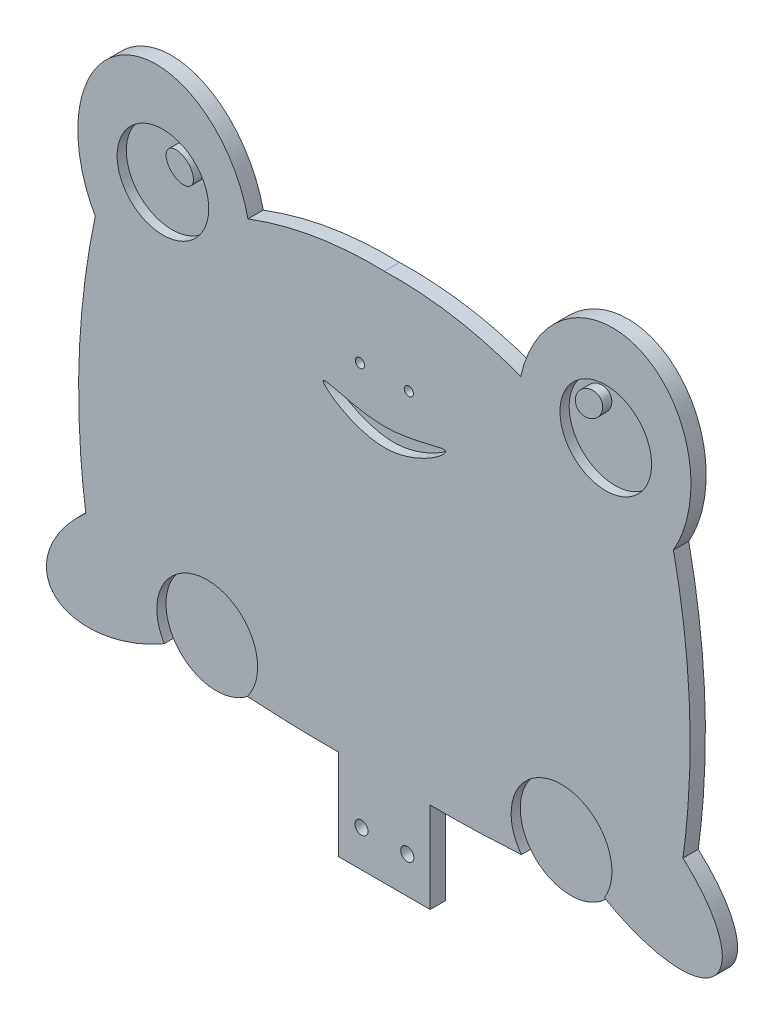
ISO-10303-21;
HEADER;
FILE_DESCRIPTION(('STEP AP214'),'2;1');
FILE_NAME('part.step','',(''),(''),'','','');
FILE_SCHEMA(('AUTOMOTIVE_DESIGN { 1 0 10303 214 1 1 1 1 }'));
ENDSEC;
DATA;
#1=APPLICATION_CONTEXT('core data for automotive mechanical design processes');
#2=APPLICATION_PROTOCOL_DEFINITION('international standard','automotive_design',2000,#1);
#3=PRODUCT_CONTEXT('',#1,'mechanical');
#4=PRODUCT('Part','Part','',(#3));
#5=PRODUCT_RELATED_PRODUCT_CATEGORY('part','',(#4));
#6=PRODUCT_DEFINITION_FORMATION('','',#4);
#7=PRODUCT_DEFINITION_CONTEXT('part definition',#1,'design');
#8=PRODUCT_DEFINITION('design','',#6,#7);
#9=PRODUCT_DEFINITION_SHAPE('','',#8);
#10=(LENGTH_UNIT() NAMED_UNIT(*) SI_UNIT(.MILLI.,.METRE.));
#11=(NAMED_UNIT(*) PLANE_ANGLE_UNIT() SI_UNIT($,.RADIAN.));
#12=(NAMED_UNIT(*) SI_UNIT($,.STERADIAN.) SOLID_ANGLE_UNIT());
#13=UNCERTAINTY_MEASURE_WITH_UNIT(LENGTH_MEASURE(1.E-05),#10,'distance_accuracy_value','');
#14=(GEOMETRIC_REPRESENTATION_CONTEXT(3) GLOBAL_UNCERTAINTY_ASSIGNED_CONTEXT((#13)) GLOBAL_UNIT_ASSIGNED_CONTEXT((#10,
#11,#12)) REPRESENTATION_CONTEXT('',''));
#15=CARTESIAN_POINT('',(0.,0.,0.));
#16=DIRECTION('',(0.,0.,1.));
#17=DIRECTION('',(1.,0.,0.));
#18=AXIS2_PLACEMENT_3D('',#15,#16,#17);
#19=CARTESIAN_POINT('',(-58.,-57.,5.));
#20=DIRECTION('',(0.,0.,-1.));
#21=DIRECTION('',(-1.,0.,0.));
#22=AXIS2_PLACEMENT_3D('',#19,#20,#21);
#23=CYLINDRICAL_SURFACE('',#22,16.5);
#24=CARTESIAN_POINT('',(-58.,-57.,2.));
#25=DIRECTION('',(0.,0.,1.));
#26=DIRECTION('',(1.,0.,0.));
#27=AXIS2_PLACEMENT_3D('',#24,#25,#26);
#28=CIRCLE('',#27,16.5);
#29=CARTESIAN_POINT('',(-72.0587340005789,-65.6372448327558,2.));
#30=VERTEX_POINT('',#29);
#31=CARTESIAN_POINT('',(-44.868666826331,-66.9909003138905,2.));
#32=VERTEX_POINT('',#31);
#33=EDGE_CURVE('E617',#30,#32,#28,.T.);
#34=ORIENTED_EDGE('',*,*,#33,.F.);
#35=DIRECTION('',(0.,0.,-1.));
#36=VECTOR('',#35,1.);
#37=CARTESIAN_POINT('',(-72.0587340005789,-65.6372448327558,5.));
#38=LINE('',#37,#36);
#39=CARTESIAN_POINT('',(-72.0587340005789,-65.6372448327558,0.));
#40=VERTEX_POINT('',#39);
#41=EDGE_CURVE('E601',#30,#40,#38,.T.);
#42=ORIENTED_EDGE('',*,*,#41,.T.);
#43=CARTESIAN_POINT('',(-58.,-57.,0.));
#44=DIRECTION('',(0.,0.,1.));
#45=DIRECTION('',(1.,0.,0.));
#46=AXIS2_PLACEMENT_3D('',#43,#44,#45);
#47=CIRCLE('',#46,16.5);
#48=CARTESIAN_POINT('',(-44.868666826331,-66.9909003138905,0.));
#49=VERTEX_POINT('',#48);
#50=EDGE_CURVE('E615',#40,#49,#47,.T.);
#51=ORIENTED_EDGE('',*,*,#50,.T.);
#52=DIRECTION('',(0.,0.,-1.));
#53=VECTOR('',#52,1.);
#54=CARTESIAN_POINT('',(-44.868666826331,-66.9909003138905,5.));
#55=LINE('',#54,#53);
#56=EDGE_CURVE('E891',#32,#49,#55,.T.);
#57=ORIENTED_EDGE('',*,*,#56,.F.);
#58=EDGE_LOOP('',(#34,#42,#51,#57));
#59=FACE_BOUND('',#58,.T.);
#60=ADVANCED_FACE('F462',(#59),#23,.T.);
#61=CARTESIAN_POINT('',(0.,0.,5.));
#62=DIRECTION('',(0.,0.,1.));
#63=DIRECTION('',(1.,0.,0.));
#64=AXIS2_PLACEMENT_3D('',#61,#62,#63);
#65=PLANE('',#64);
#66=CARTESIAN_POINT('',(-7.49999999999998,-85.5,5.));
#67=DIRECTION('',(0.,0.,1.));
#68=DIRECTION('',(1.,0.,0.));
#69=AXIS2_PLACEMENT_3D('',#66,#67,#68);
#70=CIRCLE('',#69,2.15);
#71=CARTESIAN_POINT('',(-5.34999999999998,-85.5,5.));
#72=VERTEX_POINT('',#71);
#73=EDGE_CURVE('E838',#72,#72,#70,.T.);
#74=ORIENTED_EDGE('',*,*,#73,.F.);
#75=EDGE_LOOP('',(#74));
#76=FACE_BOUND('',#75,.T.);
#77=CARTESIAN_POINT('',(7.50000000000002,-85.5,5.));
#78=DIRECTION('',(0.,0.,1.));
#79=DIRECTION('',(1.,0.,0.));
#80=AXIS2_PLACEMENT_3D('',#77,#78,#79);
#81=CIRCLE('',#80,2.15);
#82=CARTESIAN_POINT('',(9.65000000000002,-85.5,5.));
#83=VERTEX_POINT('',#82);
#84=EDGE_CURVE('E833',#83,#83,#81,.T.);
#85=ORIENTED_EDGE('',*,*,#84,.F.);
#86=EDGE_LOOP('',(#85));
#87=FACE_BOUND('',#86,.T.);
#88=CARTESIAN_POINT('',(-58.,-57.,5.));
#89=DIRECTION('',(0.,0.,1.));
#90=DIRECTION('',(1.,0.,0.));
#91=AXIS2_PLACEMENT_3D('',#88,#89,#90);
#92=CIRCLE('',#91,16.5);
#93=CARTESIAN_POINT('',(-44.868666826331,-66.9909003138905,5.));
#94=VERTEX_POINT('',#93);
#95=CARTESIAN_POINT('',(-72.0587340005789,-65.6372448327559,5.));
#96=VERTEX_POINT('',#95);
#97=EDGE_CURVE('E581',#94,#96,#92,.T.);
#98=ORIENTED_EDGE('',*,*,#97,.F.);
#99=CARTESIAN_POINT('',(-70.2828581052301,-64.5636200421426,5.));
#100=CARTESIAN_POINT('',(-35.2387588207871,-68.9830688904384,5.));
#101=CARTESIAN_POINT('',(0.,-67.5,5.));
#102=B_SPLINE_CURVE_WITH_KNOTS('',2,(#99,#100,#101),.UNSPECIFIED.,.F.,.F.,(3,3),(0.,1.),.UNSPECIFIED.);
#103=CARTESIAN_POINT('',(-15.,-67.8639775331653,5.));
#104=VERTEX_POINT('',#103);
#105=EDGE_CURVE('E975',#94,#104,#102,.T.);
#106=ORIENTED_EDGE('',*,*,#105,.T.);
#107=DIRECTION('',(0.,-1.,0.));
#108=VECTOR('',#107,1.);
#109=CARTESIAN_POINT('',(-15.,-37.5,5.));
#110=LINE('',#109,#108);
#111=CARTESIAN_POINT('',(-15.,-97.5,5.));
#112=VERTEX_POINT('',#111);
#113=EDGE_CURVE('E645',#104,#112,#110,.T.);
#114=ORIENTED_EDGE('',*,*,#113,.T.);
#115=DIRECTION('',(1.,0.,0.));
#116=VECTOR('',#115,1.);
#117=CARTESIAN_POINT('',(-15.,-97.5,5.));
#118=LINE('',#117,#116);
#119=CARTESIAN_POINT('',(15.,-97.5,5.));
#120=VERTEX_POINT('',#119);
#121=EDGE_CURVE('E639',#112,#120,#118,.T.);
#122=ORIENTED_EDGE('',*,*,#121,.T.);
#123=DIRECTION('',(0.,-1.,0.));
#124=VECTOR('',#123,1.);
#125=CARTESIAN_POINT('',(15.,-37.5,5.));
#126=LINE('',#125,#124);
#127=CARTESIAN_POINT('',(15.,-67.8639775331653,5.));
#128=VERTEX_POINT('',#127);
#129=EDGE_CURVE('E642',#128,#120,#126,.T.);
#130=ORIENTED_EDGE('',*,*,#129,.F.);
#131=CARTESIAN_POINT('',(70.2828581052301,-64.5636200421426,5.));
#132=CARTESIAN_POINT('',(35.2387588207871,-68.9830688904384,5.));
#133=CARTESIAN_POINT('',(0.,-67.5,5.));
#134=B_SPLINE_CURVE_WITH_KNOTS('',2,(#131,#132,#133),.UNSPECIFIED.,.F.,.F.,(3,3),(0.,1.),.UNSPECIFIED.);
#135=CARTESIAN_POINT('',(44.868666826331,-66.9909003138905,5.));
#136=VERTEX_POINT('',#135);
#137=EDGE_CURVE('E884',#136,#128,#134,.T.);
#138=ORIENTED_EDGE('',*,*,#137,.F.);
#139=CARTESIAN_POINT('',(58.,-57.,5.));
#140=DIRECTION('',(0.,0.,1.));
#141=DIRECTION('',(-1.,0.,0.));
#142=AXIS2_PLACEMENT_3D('',#139,#140,#141);
#143=CIRCLE('',#142,16.5);
#144=CARTESIAN_POINT('',(72.0587340005789,-65.6372448327558,5.));
#145=VERTEX_POINT('',#144);
#146=EDGE_CURVE('E807',#145,#136,#143,.T.);
#147=ORIENTED_EDGE('',*,*,#146,.F.);
#148=CARTESIAN_POINT('',(79.5578395552858,-49.7236497220535,5.));
#149=DIRECTION('',(0.,0.,-1.));
#150=DIRECTION('',(0.847998304005088,-0.52999894000318,0.));
#151=AXIS2_PLACEMENT_3D('',#148,#149,#150);
#152=ELLIPSE('',#151,35.,17.5);
#153=CARTESIAN_POINT('',(97.7708489059274,-41.5363158590221,5.));
#154=VERTEX_POINT('',#153);
#155=EDGE_CURVE('E632',#154,#145,#152,.T.);
#156=ORIENTED_EDGE('',*,*,#155,.F.);
#157=CARTESIAN_POINT('',(94.6600668169253,44.2922842673965,5.));
#158=CARTESIAN_POINT('',(105.889274695966,-8.96354800034177,5.));
#159=CARTESIAN_POINT('',(94.,-62.5,5.));
#160=B_SPLINE_CURVE_WITH_KNOTS('',2,(#157,#158,#159),.UNSPECIFIED.,.F.,.F.,(3,3),(0.,1.),.UNSPECIFIED.);
#161=CARTESIAN_POINT('',(94.6600668169253,44.2922842673965,5.));
#162=VERTEX_POINT('',#161);
#163=EDGE_CURVE('E754',#162,#154,#160,.T.);
#164=ORIENTED_EDGE('',*,*,#163,.F.);
#165=CARTESIAN_POINT('',(72.0000000000001,62.5,5.));
#166=DIRECTION('',(0.,0.,-1.));
#167=DIRECTION('',(-0.214940016820636,-0.976627251907884,0.));
#168=AXIS2_PLACEMENT_3D('',#165,#166,#167);
#169=ELLIPSE('',#168,35.1625521719047,28.);
#170=CARTESIAN_POINT('',(44.6544369465793,68.5183204709778,5.));
#171=VERTEX_POINT('',#170);
#172=EDGE_CURVE('E955',#171,#162,#169,.T.);
#173=ORIENTED_EDGE('',*,*,#172,.F.);
#174=CARTESIAN_POINT('',(44.6544369465793,68.5183204709778,5.));
#175=CARTESIAN_POINT('',(23.0941648681765,76.6590009676915,5.));
#176=CARTESIAN_POINT('',(0.,76.,5.));
#177=B_SPLINE_CURVE_WITH_KNOTS('',2,(#174,#175,#176),.UNSPECIFIED.,.F.,.F.,(3,3),(0.,1.),.UNSPECIFIED.);
#178=CARTESIAN_POINT('',(0.,76.,5.));
#179=VERTEX_POINT('',#178);
#180=EDGE_CURVE('E909',#171,#179,#177,.T.);
#181=ORIENTED_EDGE('',*,*,#180,.T.);
#182=CARTESIAN_POINT('',(-44.6544369465793,68.5183204709778,5.));
#183=CARTESIAN_POINT('',(-23.0941648681765,76.6590009676915,5.));
#184=CARTESIAN_POINT('',(0.,76.,5.));
#185=B_SPLINE_CURVE_WITH_KNOTS('',2,(#182,#183,#184),.UNSPECIFIED.,.F.,.F.,(3,3),(0.,1.),.UNSPECIFIED.);
#186=CARTESIAN_POINT('',(-44.6544369465793,68.5183204709778,5.));
#187=VERTEX_POINT('',#186);
#188=EDGE_CURVE('E958',#187,#179,#185,.T.);
#189=ORIENTED_EDGE('',*,*,#188,.F.);
#190=CARTESIAN_POINT('',(-72.0000000000001,62.5,5.));
#191=DIRECTION('',(0.,0.,1.));
#192=DIRECTION('',(0.214940016820636,-0.976627251907884,0.));
#193=AXIS2_PLACEMENT_3D('',#190,#191,#192);
#194=ELLIPSE('',#193,35.1625521719047,28.);
#195=CARTESIAN_POINT('',(-94.6600668169253,44.2922842673965,5.));
#196=VERTEX_POINT('',#195);
#197=EDGE_CURVE('E999',#187,#196,#194,.T.);
#198=ORIENTED_EDGE('',*,*,#197,.T.);
#199=CARTESIAN_POINT('',(-94.6600668169253,44.2922842673965,5.));
#200=CARTESIAN_POINT('',(-105.889274695966,-8.96354800034177,5.));
#201=CARTESIAN_POINT('',(-94.,-62.5,5.));
#202=B_SPLINE_CURVE_WITH_KNOTS('',2,(#199,#200,#201),.UNSPECIFIED.,.F.,.F.,(3,3),(0.,1.),.UNSPECIFIED.);
#203=CARTESIAN_POINT('',(-97.7708489059274,-41.5363158590221,5.));
#204=VERTEX_POINT('',#203);
#205=EDGE_CURVE('E599',#196,#204,#202,.T.);
#206=ORIENTED_EDGE('',*,*,#205,.T.);
#207=CARTESIAN_POINT('',(-79.5578395552858,-49.7236497220536,5.));
#208=DIRECTION('',(0.,0.,1.));
#209=DIRECTION('',(-0.847998304005088,-0.52999894000318,0.));
#210=AXIS2_PLACEMENT_3D('',#207,#208,#209);
#211=ELLIPSE('',#210,35.,17.5);
#212=EDGE_CURVE('E595',#204,#96,#211,.T.);
#213=ORIENTED_EDGE('',*,*,#212,.T.);
#214=EDGE_LOOP('',(#98,#106,#114,#122,#130,#138,#147,#156,#164,#173,#181,#189,#198,#206,#213));
#215=FACE_BOUND('',#214,.T.);
#216=CARTESIAN_POINT('',(-20.,35.,5.));
#217=CARTESIAN_POINT('',(-20.5630224915641,33.6874538165411,5.));
#218=CARTESIAN_POINT('',(0.,18.3125461834589,5.));
#219=CARTESIAN_POINT('',(30.0438461902122,40.7762360571894,5.));
#220=CARTESIAN_POINT('',(0.,27.7896702474734,5.));
#221=CARTESIAN_POINT('',(-19.4808236986481,36.2103297525266,5.));
#222=CARTESIAN_POINT('',(-20.,35.,5.));
#223=B_SPLINE_CURVE_WITH_KNOTS('',3,(#216,#217,#218,#219,#220,#221,#222),.UNSPECIFIED.,.T.,.F.,
(4,1,1,1,4),(0.,0.260128959323195,0.520257918646391,0.760128959323195,1.),.UNSPECIFIED.);
#224=CARTESIAN_POINT('',(-20.,35.,5.));
#225=VERTEX_POINT('',#224);
#226=EDGE_CURVE('E806',#225,#225,#223,.T.);
#227=ORIENTED_EDGE('',*,*,#226,.F.);
#228=EDGE_LOOP('',(#227));
#229=FACE_BOUND('',#228,.T.);
#230=CARTESIAN_POINT('',(8.,46.,5.));
#231=DIRECTION('',(0.,0.,1.));
#232=DIRECTION('',(1.,0.,0.));
#233=AXIS2_PLACEMENT_3D('',#230,#231,#232);
#234=CIRCLE('',#233,1.5);
#235=CARTESIAN_POINT('',(9.5,46.,5.));
#236=VERTEX_POINT('',#235);
#237=EDGE_CURVE('E822',#236,#236,#234,.T.);
#238=ORIENTED_EDGE('',*,*,#237,.F.);
#239=EDGE_LOOP('',(#238));
#240=FACE_BOUND('',#239,.T.);
#241=CARTESIAN_POINT('',(-8.,46.,5.));
#242=DIRECTION('',(0.,0.,1.));
#243=DIRECTION('',(1.,0.,0.));
#244=AXIS2_PLACEMENT_3D('',#241,#242,#243);
#245=CIRCLE('',#244,1.5);
#246=CARTESIAN_POINT('',(-6.5,46.,5.));
#247=VERTEX_POINT('',#246);
#248=EDGE_CURVE('E827',#247,#247,#245,.T.);
#249=ORIENTED_EDGE('',*,*,#248,.F.);
#250=EDGE_LOOP('',(#249));
#251=FACE_BOUND('',#250,.T.);
#252=CARTESIAN_POINT('',(72.5,65.,5.));
#253=DIRECTION('',(0.,0.,-1.));
#254=DIRECTION('',(-1.,0.,0.));
#255=AXIS2_PLACEMENT_3D('',#252,#253,#254);
#256=CIRCLE('',#255,15.);
#257=CARTESIAN_POINT('',(57.5,65.,5.));
#258=VERTEX_POINT('',#257);
#259=EDGE_CURVE('E744',#258,#258,#256,.T.);
#260=ORIENTED_EDGE('',*,*,#259,.T.);
#261=EDGE_LOOP('',(#260));
#262=FACE_BOUND('',#261,.T.);
#263=CARTESIAN_POINT('',(-72.5,65.,5.));
#264=DIRECTION('',(0.,0.,1.));
#265=DIRECTION('',(1.,0.,0.));
#266=AXIS2_PLACEMENT_3D('',#263,#264,#265);
#267=CIRCLE('',#266,15.);
#268=CARTESIAN_POINT('',(-57.5,65.,5.));
#269=VERTEX_POINT('',#268);
#270=EDGE_CURVE('E732',#269,#269,#267,.T.);
#271=ORIENTED_EDGE('',*,*,#270,.F.);
#272=EDGE_LOOP('',(#271));
#273=FACE_BOUND('',#272,.T.);
#274=ADVANCED_FACE('F596',(#76,#87,#215,#229,#240,#251,#262,#273),#65,.T.);
#275=DIRECTION('',(0.,0.,-1.));
#276=VECTOR('',#275,1.);
#277=SURFACE_OF_LINEAR_EXTRUSION('',#169,#276);
#278=CARTESIAN_POINT('',(72.0000000000001,62.5,0.));
#279=DIRECTION('',(0.,0.,-1.));
#280=DIRECTION('',(-0.214940016820636,-0.976627251907884,0.));
#281=AXIS2_PLACEMENT_3D('',#278,#279,#280);
#282=ELLIPSE('',#281,35.1625521719047,28.);
#283=CARTESIAN_POINT('',(44.6544369465793,68.5183204709778,0.));
#284=VERTEX_POINT('',#283);
#285=CARTESIAN_POINT('',(94.6600668169253,44.2922842673965,0.));
#286=VERTEX_POINT('',#285);
#287=EDGE_CURVE('E609',#284,#286,#282,.T.);
#288=ORIENTED_EDGE('',*,*,#287,.F.);
#289=DIRECTION('',(0.,0.,-1.));
#290=VECTOR('',#289,1.);
#291=CARTESIAN_POINT('',(44.6544369465793,68.5183204709778,5.));
#292=LINE('',#291,#290);
#293=EDGE_CURVE('E471',#171,#284,#292,.T.);
#294=ORIENTED_EDGE('',*,*,#293,.F.);
#295=ORIENTED_EDGE('',*,*,#172,.T.);
#296=DIRECTION('',(0.,0.,-1.));
#297=VECTOR('',#296,1.);
#298=CARTESIAN_POINT('',(94.6600668169253,44.2922842673965,5.));
#299=LINE('',#298,#297);
#300=EDGE_CURVE('E12',#162,#286,#299,.T.);
#301=ORIENTED_EDGE('',*,*,#300,.T.);
#302=EDGE_LOOP('',(#288,#294,#295,#301));
#303=FACE_BOUND('',#302,.T.);
#304=ADVANCED_FACE('F697',(#303),#277,.T.);
#305=DIRECTION('',(0.,0.,-1.));
#306=VECTOR('',#305,1.);
#307=SURFACE_OF_LINEAR_EXTRUSION('',#177,#306);
#308=CARTESIAN_POINT('',(44.6544369465793,68.5183204709778,0.));
#309=CARTESIAN_POINT('',(23.0941648681765,76.6590009676915,0.));
#310=CARTESIAN_POINT('',(0.,76.,0.));
#311=B_SPLINE_CURVE_WITH_KNOTS('',2,(#308,#309,#310),.UNSPECIFIED.,.F.,.F.,(3,3),(0.,1.),.UNSPECIFIED.);
#312=CARTESIAN_POINT('',(0.,76.,0.));
#313=VERTEX_POINT('',#312);
#314=EDGE_CURVE('E907',#284,#313,#311,.T.);
#315=ORIENTED_EDGE('',*,*,#314,.T.);
#316=DIRECTION('',(0.,0.,-1.));
#317=VECTOR('',#316,1.);
#318=CARTESIAN_POINT('',(0.,76.,5.));
#319=LINE('',#318,#317);
#320=EDGE_CURVE('E899',#179,#313,#319,.T.);
#321=ORIENTED_EDGE('',*,*,#320,.F.);
#322=ORIENTED_EDGE('',*,*,#180,.F.);
#323=ORIENTED_EDGE('',*,*,#293,.T.);
#324=EDGE_LOOP('',(#315,#321,#322,#323));
#325=FACE_BOUND('',#324,.T.);
#326=ADVANCED_FACE('F706',(#325),#307,.F.);
#327=DIRECTION('',(0.,0.,-1.));
#328=VECTOR('',#327,1.);
#329=SURFACE_OF_LINEAR_EXTRUSION('',#185,#328);
#330=CARTESIAN_POINT('',(-44.6544369465793,68.5183204709778,0.));
#331=CARTESIAN_POINT('',(-23.0941648681765,76.6590009676915,0.));
#332=CARTESIAN_POINT('',(0.,76.,0.));
#333=B_SPLINE_CURVE_WITH_KNOTS('',2,(#330,#331,#332),.UNSPECIFIED.,.F.,.F.,(3,3),(0.,1.),.UNSPECIFIED.);
#334=CARTESIAN_POINT('',(-44.6544369465793,68.5183204709778,0.));
#335=VERTEX_POINT('',#334);
#336=EDGE_CURVE('E916',#335,#313,#333,.T.);
#337=ORIENTED_EDGE('',*,*,#336,.F.);
#338=DIRECTION('',(0.,0.,-1.));
#339=VECTOR('',#338,1.);
#340=CARTESIAN_POINT('',(-44.6544369465793,68.5183204709778,5.));
#341=LINE('',#340,#339);
#342=EDGE_CURVE('E897',#187,#335,#341,.T.);
#343=ORIENTED_EDGE('',*,*,#342,.F.);
#344=ORIENTED_EDGE('',*,*,#188,.T.);
#345=ORIENTED_EDGE('',*,*,#320,.T.);
#346=EDGE_LOOP('',(#337,#343,#344,#345));
#347=FACE_BOUND('',#346,.T.);
#348=ADVANCED_FACE('F1011',(#347),#329,.T.);
#349=DIRECTION('',(0.,0.,-1.));
#350=VECTOR('',#349,1.);
#351=SURFACE_OF_LINEAR_EXTRUSION('',#194,#350);
#352=CARTESIAN_POINT('',(-72.0000000000001,62.5,0.));
#353=DIRECTION('',(0.,0.,1.));
#354=DIRECTION('',(0.214940016820636,-0.976627251907884,0.));
#355=AXIS2_PLACEMENT_3D('',#352,#353,#354);
#356=ELLIPSE('',#355,35.1625521719047,28.);
#357=CARTESIAN_POINT('',(-94.6600668169253,44.2922842673965,0.));
#358=VERTEX_POINT('',#357);
#359=EDGE_CURVE('E932',#335,#358,#356,.T.);
#360=ORIENTED_EDGE('',*,*,#359,.T.);
#361=DIRECTION('',(0.,0.,-1.));
#362=VECTOR('',#361,1.);
#363=CARTESIAN_POINT('',(-94.6600668169253,44.2922842673965,5.));
#364=LINE('',#363,#362);
#365=EDGE_CURVE('E894',#196,#358,#364,.T.);
#366=ORIENTED_EDGE('',*,*,#365,.F.);
#367=ORIENTED_EDGE('',*,*,#197,.F.);
#368=ORIENTED_EDGE('',*,*,#342,.T.);
#369=EDGE_LOOP('',(#360,#366,#367,#368));
#370=FACE_BOUND('',#369,.T.);
#371=ADVANCED_FACE('F993',(#370),#351,.F.);
#372=DIRECTION('',(0.,0.,-1.));
#373=VECTOR('',#372,1.);
#374=SURFACE_OF_LINEAR_EXTRUSION('',#202,#373);
#375=CARTESIAN_POINT('',(-94.6600668169253,44.2922842673965,0.));
#376=CARTESIAN_POINT('',(-105.889274695966,-8.96354800034177,0.));
#377=CARTESIAN_POINT('',(-94.,-62.5,0.));
#378=B_SPLINE_CURVE_WITH_KNOTS('',2,(#375,#376,#377),.UNSPECIFIED.,.F.,.F.,(3,3),(0.,1.),.UNSPECIFIED.);
#379=CARTESIAN_POINT('',(-97.7708489059274,-41.5363158590221,0.));
#380=VERTEX_POINT('',#379);
#381=EDGE_CURVE('E937',#358,#380,#378,.T.);
#382=ORIENTED_EDGE('',*,*,#381,.T.);
#383=DIRECTION('',(0.,0.,-1.));
#384=VECTOR('',#383,1.);
#385=CARTESIAN_POINT('',(-97.7708489059274,-41.5363158590221,5.));
#386=LINE('',#385,#384);
#387=EDGE_CURVE('E619',#204,#380,#386,.T.);
#388=ORIENTED_EDGE('',*,*,#387,.F.);
#389=ORIENTED_EDGE('',*,*,#205,.F.);
#390=ORIENTED_EDGE('',*,*,#365,.T.);
#391=EDGE_LOOP('',(#382,#388,#389,#390));
#392=FACE_BOUND('',#391,.T.);
#393=ADVANCED_FACE('F990',(#392),#374,.F.);
#394=DIRECTION('',(0.,0.,-1.));
#395=VECTOR('',#394,1.);
#396=SURFACE_OF_LINEAR_EXTRUSION('',#102,#395);
#397=CARTESIAN_POINT('',(-70.2828581052301,-64.5636200421426,0.));
#398=CARTESIAN_POINT('',(-35.2387588207871,-68.9830688904384,0.));
#399=CARTESIAN_POINT('',(0.,-67.5,0.));
#400=B_SPLINE_CURVE_WITH_KNOTS('',2,(#397,#398,#399),.UNSPECIFIED.,.F.,.F.,(3,3),(0.,1.),.UNSPECIFIED.);
#401=CARTESIAN_POINT('',(-15.,-67.8639775331653,0.));
#402=VERTEX_POINT('',#401);
#403=EDGE_CURVE('E628',#49,#402,#400,.T.);
#404=ORIENTED_EDGE('',*,*,#403,.T.);
#405=DIRECTION('',(0.,0.,-1.));
#406=VECTOR('',#405,1.);
#407=CARTESIAN_POINT('',(-15.,-67.8639775331653,5.));
#408=LINE('',#407,#406);
#409=EDGE_CURVE('E889',#104,#402,#408,.T.);
#410=ORIENTED_EDGE('',*,*,#409,.F.);
#411=ORIENTED_EDGE('',*,*,#105,.F.);
#412=EDGE_CURVE('E587',#94,#32,#55,.T.);
#413=ORIENTED_EDGE('',*,*,#412,.T.);
#414=ORIENTED_EDGE('',*,*,#56,.T.);
#415=EDGE_LOOP('',(#404,#410,#411,#413,#414));
#416=FACE_BOUND('',#415,.T.);
#417=ADVANCED_FACE('F971',(#416),#396,.F.);
#418=DIRECTION('',(0.,0.,-1.));
#419=VECTOR('',#418,1.);
#420=SURFACE_OF_LINEAR_EXTRUSION('',#134,#419);
#421=CARTESIAN_POINT('',(70.2828581052301,-64.5636200421426,0.));
#422=CARTESIAN_POINT('',(35.2387588207871,-68.9830688904384,0.));
#423=CARTESIAN_POINT('',(0.,-67.5,0.));
#424=B_SPLINE_CURVE_WITH_KNOTS('',2,(#421,#422,#423),.UNSPECIFIED.,.F.,.F.,(3,3),(0.,1.),.UNSPECIFIED.);
#425=CARTESIAN_POINT('',(44.868666826331,-66.9909003138905,0.));
#426=VERTEX_POINT('',#425);
#427=CARTESIAN_POINT('',(15.,-67.8639775331653,0.));
#428=VERTEX_POINT('',#427);
#429=EDGE_CURVE('E882',#426,#428,#424,.T.);
#430=ORIENTED_EDGE('',*,*,#429,.F.);
#431=DIRECTION('',(0.,0.,-1.));
#432=VECTOR('',#431,1.);
#433=CARTESIAN_POINT('',(44.868666826331,-66.9909003138905,5.));
#434=LINE('',#433,#432);
#435=CARTESIAN_POINT('',(44.868666826331,-66.9909003138905,2.));
#436=VERTEX_POINT('',#435);
#437=EDGE_CURVE('E877',#436,#426,#434,.T.);
#438=ORIENTED_EDGE('',*,*,#437,.F.);
#439=EDGE_CURVE('E871',#136,#436,#434,.T.);
#440=ORIENTED_EDGE('',*,*,#439,.F.);
#441=ORIENTED_EDGE('',*,*,#137,.T.);
#442=DIRECTION('',(0.,0.,-1.));
#443=VECTOR('',#442,1.);
#444=CARTESIAN_POINT('',(15.,-67.8639775331653,5.));
#445=LINE('',#444,#443);
#446=EDGE_CURVE('E876',#128,#428,#445,.T.);
#447=ORIENTED_EDGE('',*,*,#446,.T.);
#448=EDGE_LOOP('',(#430,#438,#440,#441,#447));
#449=FACE_BOUND('',#448,.T.);
#450=ADVANCED_FACE('F880',(#449),#420,.T.);
#451=DIRECTION('',(0.,0.,-1.));
#452=VECTOR('',#451,1.);
#453=SURFACE_OF_LINEAR_EXTRUSION('',#160,#452);
#454=CARTESIAN_POINT('',(94.6600668169253,44.2922842673965,0.));
#455=CARTESIAN_POINT('',(105.889274695966,-8.96354800034177,0.));
#456=CARTESIAN_POINT('',(94.,-62.5,0.));
#457=B_SPLINE_CURVE_WITH_KNOTS('',2,(#454,#455,#456),.UNSPECIFIED.,.F.,.F.,(3,3),(0.,1.),.UNSPECIFIED.);
#458=CARTESIAN_POINT('',(97.7708489059274,-41.5363158590221,0.));
#459=VERTEX_POINT('',#458);
#460=EDGE_CURVE('E607',#286,#459,#457,.T.);
#461=ORIENTED_EDGE('',*,*,#460,.F.);
#462=ORIENTED_EDGE('',*,*,#300,.F.);
#463=ORIENTED_EDGE('',*,*,#163,.T.);
#464=DIRECTION('',(0.,0.,-1.));
#465=VECTOR('',#464,1.);
#466=CARTESIAN_POINT('',(97.7708489059274,-41.5363158590221,5.));
#467=LINE('',#466,#465);
#468=EDGE_CURVE('E883',#154,#459,#467,.T.);
#469=ORIENTED_EDGE('',*,*,#468,.T.);
#470=EDGE_LOOP('',(#461,#462,#463,#469));
#471=FACE_BOUND('',#470,.T.);
#472=ADVANCED_FACE('F692',(#471),#453,.T.);
#473=CARTESIAN_POINT('',(0.,0.,0.));
#474=DIRECTION('',(0.,0.,1.));
#475=DIRECTION('',(1.,0.,0.));
#476=AXIS2_PLACEMENT_3D('',#473,#474,#475);
#477=PLANE('',#476);
#478=CARTESIAN_POINT('',(-7.49999999999998,-85.5,0.));
#479=DIRECTION('',(0.,0.,1.));
#480=DIRECTION('',(1.,0.,0.));
#481=AXIS2_PLACEMENT_3D('',#478,#479,#480);
#482=CIRCLE('',#481,2.15);
#483=CARTESIAN_POINT('',(-5.34999999999998,-85.5,0.));
#484=VERTEX_POINT('',#483);
#485=EDGE_CURVE('E835',#484,#484,#482,.T.);
#486=ORIENTED_EDGE('',*,*,#485,.T.);
#487=EDGE_LOOP('',(#486));
#488=FACE_BOUND('',#487,.T.);
#489=CARTESIAN_POINT('',(7.50000000000002,-85.5,0.));
#490=DIRECTION('',(0.,0.,1.));
#491=DIRECTION('',(1.,0.,0.));
#492=AXIS2_PLACEMENT_3D('',#489,#490,#491);
#493=CIRCLE('',#492,2.15);
#494=CARTESIAN_POINT('',(9.65000000000002,-85.5,0.));
#495=VERTEX_POINT('',#494);
#496=EDGE_CURVE('E842',#495,#495,#493,.T.);
#497=ORIENTED_EDGE('',*,*,#496,.T.);
#498=EDGE_LOOP('',(#497));
#499=FACE_BOUND('',#498,.T.);
#500=DIRECTION('',(0.,-1.,0.));
#501=VECTOR('',#500,1.);
#502=CARTESIAN_POINT('',(-15.,-37.5,0.));
#503=LINE('',#502,#501);
#504=CARTESIAN_POINT('',(-15.,-97.5,0.));
#505=VERTEX_POINT('',#504);
#506=EDGE_CURVE('E643',#402,#505,#503,.T.);
#507=ORIENTED_EDGE('',*,*,#506,.F.);
#508=ORIENTED_EDGE('',*,*,#403,.F.);
#509=ORIENTED_EDGE('',*,*,#50,.F.);
#510=CARTESIAN_POINT('',(-79.5578395552858,-49.7236497220536,0.));
#511=DIRECTION('',(0.,0.,1.));
#512=DIRECTION('',(-0.847998304005088,-0.52999894000318,0.));
#513=AXIS2_PLACEMENT_3D('',#510,#511,#512);
#514=ELLIPSE('',#513,35.,17.5);
#515=EDGE_CURVE('E602',#380,#40,#514,.T.);
#516=ORIENTED_EDGE('',*,*,#515,.F.);
#517=ORIENTED_EDGE('',*,*,#381,.F.);
#518=ORIENTED_EDGE('',*,*,#359,.F.);
#519=ORIENTED_EDGE('',*,*,#336,.T.);
#520=ORIENTED_EDGE('',*,*,#314,.F.);
#521=ORIENTED_EDGE('',*,*,#287,.T.);
#522=ORIENTED_EDGE('',*,*,#460,.T.);
#523=CARTESIAN_POINT('',(79.5578395552858,-49.7236497220535,0.));
#524=DIRECTION('',(0.,0.,-1.));
#525=DIRECTION('',(0.847998304005088,-0.52999894000318,0.));
#526=AXIS2_PLACEMENT_3D('',#523,#524,#525);
#527=ELLIPSE('',#526,35.,17.5);
#528=CARTESIAN_POINT('',(72.0587340005789,-65.6372448327558,0.));
#529=VERTEX_POINT('',#528);
#530=EDGE_CURVE('E629',#459,#529,#527,.T.);
#531=ORIENTED_EDGE('',*,*,#530,.T.);
#532=CARTESIAN_POINT('',(58.,-57.,0.));
#533=DIRECTION('',(0.,0.,-1.));
#534=DIRECTION('',(-1.,0.,0.));
#535=AXIS2_PLACEMENT_3D('',#532,#533,#534);
#536=CIRCLE('',#535,16.5);
#537=EDGE_CURVE('E630',#529,#426,#536,.T.);
#538=ORIENTED_EDGE('',*,*,#537,.T.);
#539=ORIENTED_EDGE('',*,*,#429,.T.);
#540=DIRECTION('',(0.,-1.,0.));
#541=VECTOR('',#540,1.);
#542=CARTESIAN_POINT('',(15.,-37.5,0.));
#543=LINE('',#542,#541);
#544=CARTESIAN_POINT('',(15.,-97.5,0.));
#545=VERTEX_POINT('',#544);
#546=EDGE_CURVE('E651',#428,#545,#543,.T.);
#547=ORIENTED_EDGE('',*,*,#546,.T.);
#548=DIRECTION('',(1.,0.,0.));
#549=VECTOR('',#548,1.);
#550=CARTESIAN_POINT('',(-15.,-97.5,0.));
#551=LINE('',#550,#549);
#552=EDGE_CURVE('E648',#505,#545,#551,.T.);
#553=ORIENTED_EDGE('',*,*,#552,.F.);
#554=EDGE_LOOP('',(#507,#508,#509,#516,#517,#518,#519,#520,#521,#522,#531,#538,#539,#547,#553));
#555=FACE_BOUND('',#554,.T.);
#556=ADVANCED_FACE('F626',(#488,#499,#555),#477,.F.);
#557=CARTESIAN_POINT('',(15.,-37.5,5.));
#558=DIRECTION('',(1.,0.,0.));
#559=DIRECTION('',(0.,1.,0.));
#560=AXIS2_PLACEMENT_3D('',#557,#558,#559);
#561=PLANE('',#560);
#562=ORIENTED_EDGE('',*,*,#546,.F.);
#563=ORIENTED_EDGE('',*,*,#446,.F.);
#564=ORIENTED_EDGE('',*,*,#129,.T.);
#565=DIRECTION('',(0.,0.,-1.));
#566=VECTOR('',#565,1.);
#567=CARTESIAN_POINT('',(15.,-97.5,5.));
#568=LINE('',#567,#566);
#569=EDGE_CURVE('E635',#120,#545,#568,.T.);
#570=ORIENTED_EDGE('',*,*,#569,.T.);
#571=EDGE_LOOP('',(#562,#563,#564,#570));
#572=FACE_BOUND('',#571,.T.);
#573=ADVANCED_FACE('F684',(#572),#561,.T.);
#574=CARTESIAN_POINT('',(-15.,-37.5,5.));
#575=DIRECTION('',(1.,0.,0.));
#576=DIRECTION('',(0.,1.,0.));
#577=AXIS2_PLACEMENT_3D('',#574,#575,#576);
#578=PLANE('',#577);
#579=ORIENTED_EDGE('',*,*,#113,.F.);
#580=ORIENTED_EDGE('',*,*,#409,.T.);
#581=ORIENTED_EDGE('',*,*,#506,.T.);
#582=DIRECTION('',(0.,0.,-1.));
#583=VECTOR('',#582,1.);
#584=CARTESIAN_POINT('',(-15.,-97.5,5.));
#585=LINE('',#584,#583);
#586=EDGE_CURVE('E647',#112,#505,#585,.T.);
#587=ORIENTED_EDGE('',*,*,#586,.F.);
#588=EDGE_LOOP('',(#579,#580,#581,#587));
#589=FACE_BOUND('',#588,.T.);
#590=ADVANCED_FACE('F682',(#589),#578,.F.);
#591=CARTESIAN_POINT('',(-15.,-97.5,5.));
#592=DIRECTION('',(0.,1.,0.));
#593=DIRECTION('',(0.,0.,1.));
#594=AXIS2_PLACEMENT_3D('',#591,#592,#593);
#595=PLANE('',#594);
#596=ORIENTED_EDGE('',*,*,#552,.T.);
#597=ORIENTED_EDGE('',*,*,#569,.F.);
#598=ORIENTED_EDGE('',*,*,#121,.F.);
#599=ORIENTED_EDGE('',*,*,#586,.T.);
#600=EDGE_LOOP('',(#596,#597,#598,#599));
#601=FACE_BOUND('',#600,.T.);
#602=ADVANCED_FACE('F464',(#601),#595,.F.);
#603=DIRECTION('',(0.,0.,-1.));
#604=VECTOR('',#603,1.);
#605=SURFACE_OF_LINEAR_EXTRUSION('',#152,#604);
#606=ORIENTED_EDGE('',*,*,#530,.F.);
#607=ORIENTED_EDGE('',*,*,#468,.F.);
#608=ORIENTED_EDGE('',*,*,#155,.T.);
#609=DIRECTION('',(0.,0.,-1.));
#610=VECTOR('',#609,1.);
#611=CARTESIAN_POINT('',(72.0587340005789,-65.6372448327558,5.));
#612=LINE('',#611,#610);
#613=CARTESIAN_POINT('',(72.0587340005789,-65.6372448327558,2.));
#614=VERTEX_POINT('',#613);
#615=EDGE_CURVE('E659',#614,#145,#612,.F.);
#616=ORIENTED_EDGE('',*,*,#615,.F.);
#617=EDGE_CURVE('E623',#529,#614,#612,.F.);
#618=ORIENTED_EDGE('',*,*,#617,.F.);
#619=EDGE_LOOP('',(#606,#607,#608,#616,#618));
#620=FACE_BOUND('',#619,.T.);
#621=ADVANCED_FACE('F672',(#620),#605,.T.);
#622=CARTESIAN_POINT('',(58.,-57.,5.));
#623=DIRECTION('',(0.,0.,-1.));
#624=DIRECTION('',(-1.,0.,0.));
#625=AXIS2_PLACEMENT_3D('',#622,#623,#624);
#626=CYLINDRICAL_SURFACE('',#625,16.5);
#627=CARTESIAN_POINT('',(58.,-57.,2.));
#628=DIRECTION('',(0.,0.,1.));
#629=DIRECTION('',(-1.,0.,0.));
#630=AXIS2_PLACEMENT_3D('',#627,#628,#629);
#631=CIRCLE('',#630,16.5);
#632=EDGE_CURVE('E591',#436,#614,#631,.T.);
#633=ORIENTED_EDGE('',*,*,#632,.F.);
#634=ORIENTED_EDGE('',*,*,#437,.T.);
#635=ORIENTED_EDGE('',*,*,#537,.F.);
#636=ORIENTED_EDGE('',*,*,#617,.T.);
#637=EDGE_LOOP('',(#633,#634,#635,#636));
#638=FACE_BOUND('',#637,.T.);
#639=ADVANCED_FACE('F676',(#638),#626,.T.);
#640=DIRECTION('',(0.,0.,-1.));
#641=VECTOR('',#640,1.);
#642=SURFACE_OF_LINEAR_EXTRUSION('',#211,#641);
#643=ORIENTED_EDGE('',*,*,#212,.F.);
#644=ORIENTED_EDGE('',*,*,#387,.T.);
#645=ORIENTED_EDGE('',*,*,#515,.T.);
#646=ORIENTED_EDGE('',*,*,#41,.F.);
#647=EDGE_CURVE('E466',#96,#30,#38,.T.);
#648=ORIENTED_EDGE('',*,*,#647,.F.);
#649=EDGE_LOOP('',(#643,#644,#645,#646,#648));
#650=FACE_BOUND('',#649,.T.);
#651=ADVANCED_FACE('F605',(#650),#642,.F.);
#652=CARTESIAN_POINT('',(72.5,65.,2.));
#653=DIRECTION('',(0.,0.,-1.));
#654=DIRECTION('',(-1.,0.,0.));
#655=AXIS2_PLACEMENT_3D('',#652,#653,#654);
#656=PLANE('',#655);
#657=CARTESIAN_POINT('',(72.5,65.,2.));
#658=DIRECTION('',(0.,0.,-1.));
#659=DIRECTION('',(-1.,0.,0.));
#660=AXIS2_PLACEMENT_3D('',#657,#658,#659);
#661=CIRCLE('',#660,15.);
#662=CARTESIAN_POINT('',(57.5,65.,2.));
#663=VERTEX_POINT('',#662);
#664=EDGE_CURVE('E747',#663,#663,#661,.T.);
#665=ORIENTED_EDGE('',*,*,#664,.F.);
#666=EDGE_LOOP('',(#665));
#667=FACE_BOUND('',#666,.T.);
#668=CARTESIAN_POINT('',(67.,72.,2.));
#669=DIRECTION('',(0.,0.,-1.));
#670=DIRECTION('',(-0.737277336810126,-0.675590207615658,0.));
#671=AXIS2_PLACEMENT_3D('',#668,#669,#670);
#672=ELLIPSE('',#671,5.00000000000003,3.74999999999999);
#673=CARTESIAN_POINT('',(63.3136133159494,68.6220489619217,2.));
#674=VERTEX_POINT('',#673);
#675=EDGE_CURVE('E735',#674,#674,#672,.T.);
#676=ORIENTED_EDGE('',*,*,#675,.T.);
#677=EDGE_LOOP('',(#676));
#678=FACE_BOUND('',#677,.T.);
#679=ADVANCED_FACE('F765',(#667,#678),#656,.F.);
#680=CARTESIAN_POINT('',(72.5,65.,2.));
#681=DIRECTION('',(0.,0.,1.));
#682=DIRECTION('',(1.,0.,0.));
#683=AXIS2_PLACEMENT_3D('',#680,#681,#682);
#684=CYLINDRICAL_SURFACE('',#683,15.);
#685=ORIENTED_EDGE('',*,*,#664,.T.);
#686=EDGE_LOOP('',(#685));
#687=FACE_BOUND('',#686,.T.);
#688=ORIENTED_EDGE('',*,*,#259,.F.);
#689=EDGE_LOOP('',(#688));
#690=FACE_BOUND('',#689,.T.);
#691=ADVANCED_FACE('F763',(#687,#690),#684,.F.);
#692=DIRECTION('',(0.,0.,1.));
#693=VECTOR('',#692,1.);
#694=SURFACE_OF_LINEAR_EXTRUSION('',#672,#693);
#695=ORIENTED_EDGE('',*,*,#675,.F.);
#696=EDGE_LOOP('',(#695));
#697=FACE_BOUND('',#696,.T.);
#698=CARTESIAN_POINT('',(67.,72.,5.));
#699=DIRECTION('',(0.,0.,-1.));
#700=DIRECTION('',(-0.737277336810126,-0.675590207615658,0.));
#701=AXIS2_PLACEMENT_3D('',#698,#699,#700);
#702=ELLIPSE('',#701,5.00000000000003,3.74999999999999);
#703=CARTESIAN_POINT('',(63.3136133159494,68.6220489619217,5.));
#704=VERTEX_POINT('',#703);
#705=EDGE_CURVE('E729',#704,#704,#702,.T.);
#706=ORIENTED_EDGE('',*,*,#705,.T.);
#707=EDGE_LOOP('',(#706));
#708=FACE_BOUND('',#707,.T.);
#709=ADVANCED_FACE('F759',(#697,#708),#694,.F.);
#710=CARTESIAN_POINT('',(-72.5,65.,2.));
#711=DIRECTION('',(0.,0.,1.));
#712=DIRECTION('',(1.,0.,0.));
#713=AXIS2_PLACEMENT_3D('',#710,#711,#712);
#714=CYLINDRICAL_SURFACE('',#713,15.);
#715=CARTESIAN_POINT('',(-72.5,65.,2.));
#716=DIRECTION('',(0.,0.,1.));
#717=DIRECTION('',(1.,0.,0.));
#718=AXIS2_PLACEMENT_3D('',#715,#716,#717);
#719=CIRCLE('',#718,15.);
#720=CARTESIAN_POINT('',(-57.5,65.,2.));
#721=VERTEX_POINT('',#720);
#722=EDGE_CURVE('E652',#721,#721,#719,.T.);
#723=ORIENTED_EDGE('',*,*,#722,.F.);
#724=EDGE_LOOP('',(#723));
#725=FACE_BOUND('',#724,.T.);
#726=ORIENTED_EDGE('',*,*,#270,.T.);
#727=EDGE_LOOP('',(#726));
#728=FACE_BOUND('',#727,.T.);
#729=ADVANCED_FACE('F762',(#725,#728),#714,.F.);
#730=CARTESIAN_POINT('',(-72.5,65.,2.));
#731=DIRECTION('',(0.,0.,1.));
#732=DIRECTION('',(1.,0.,0.));
#733=AXIS2_PLACEMENT_3D('',#730,#731,#732);
#734=PLANE('',#733);
#735=CARTESIAN_POINT('',(-67.,72.,2.));
#736=DIRECTION('',(0.,0.,1.));
#737=DIRECTION('',(0.737277336810118,-0.675590207615667,0.));
#738=AXIS2_PLACEMENT_3D('',#735,#736,#737);
#739=ELLIPSE('',#738,5.00000000000002,3.74999999999989);
#740=CARTESIAN_POINT('',(-63.3136133159494,68.6220489619216,2.));
#741=VERTEX_POINT('',#740);
#742=EDGE_CURVE('E728',#741,#741,#739,.T.);
#743=ORIENTED_EDGE('',*,*,#742,.F.);
#744=EDGE_LOOP('',(#743));
#745=FACE_BOUND('',#744,.T.);
#746=ORIENTED_EDGE('',*,*,#722,.T.);
#747=EDGE_LOOP('',(#746));
#748=FACE_BOUND('',#747,.T.);
#749=ADVANCED_FACE('F774',(#745,#748),#734,.T.);
#750=DIRECTION('',(0.,0.,1.));
#751=VECTOR('',#750,1.);
#752=SURFACE_OF_LINEAR_EXTRUSION('',#739,#751);
#753=ORIENTED_EDGE('',*,*,#742,.T.);
#754=EDGE_LOOP('',(#753));
#755=FACE_BOUND('',#754,.T.);
#756=CARTESIAN_POINT('',(-67.,72.,5.));
#757=DIRECTION('',(0.,0.,1.));
#758=DIRECTION('',(0.737277336810118,-0.675590207615667,0.));
#759=AXIS2_PLACEMENT_3D('',#756,#757,#758);
#760=ELLIPSE('',#759,5.00000000000002,3.74999999999989);
#761=CARTESIAN_POINT('',(-63.3136133159494,68.6220489619216,5.));
#762=VERTEX_POINT('',#761);
#763=EDGE_CURVE('E726',#762,#762,#760,.T.);
#764=ORIENTED_EDGE('',*,*,#763,.F.);
#765=EDGE_LOOP('',(#764));
#766=FACE_BOUND('',#765,.T.);
#767=ADVANCED_FACE('F713',(#755,#766),#752,.T.);
#768=ORIENTED_EDGE('',*,*,#705,.F.);
#769=EDGE_LOOP('',(#768));
#770=FACE_BOUND('',#769,.T.);
#771=ADVANCED_FACE('F700',(#770),#65,.T.);
#772=ORIENTED_EDGE('',*,*,#763,.T.);
#773=EDGE_LOOP('',(#772));
#774=FACE_BOUND('',#773,.T.);
#775=ADVANCED_FACE('F701',(#774),#65,.T.);
#776=CARTESIAN_POINT('',(-8.,46.,2.));
#777=DIRECTION('',(0.,0.,1.));
#778=DIRECTION('',(1.,0.,0.));
#779=AXIS2_PLACEMENT_3D('',#776,#777,#778);
#780=CYLINDRICAL_SURFACE('',#779,1.5);
#781=CARTESIAN_POINT('',(-8.,46.,2.));
#782=DIRECTION('',(0.,0.,1.));
#783=DIRECTION('',(1.,0.,0.));
#784=AXIS2_PLACEMENT_3D('',#781,#782,#783);
#785=CIRCLE('',#784,1.5);
#786=CARTESIAN_POINT('',(-6.5,46.,2.));
#787=VERTEX_POINT('',#786);
#788=EDGE_CURVE('E825',#787,#787,#785,.T.);
#789=ORIENTED_EDGE('',*,*,#788,.F.);
#790=EDGE_LOOP('',(#789));
#791=FACE_BOUND('',#790,.T.);
#792=ORIENTED_EDGE('',*,*,#248,.T.);
#793=EDGE_LOOP('',(#792));
#794=FACE_BOUND('',#793,.T.);
#795=ADVANCED_FACE('F716',(#791,#794),#780,.F.);
#796=CARTESIAN_POINT('',(-8.,46.,2.));
#797=DIRECTION('',(0.,0.,1.));
#798=DIRECTION('',(1.,0.,0.));
#799=AXIS2_PLACEMENT_3D('',#796,#797,#798);
#800=PLANE('',#799);
#801=ORIENTED_EDGE('',*,*,#788,.T.);
#802=EDGE_LOOP('',(#801));
#803=FACE_BOUND('',#802,.T.);
#804=ADVANCED_FACE('F721',(#803),#800,.T.);
#805=CARTESIAN_POINT('',(8.,46.,2.));
#806=DIRECTION('',(0.,0.,1.));
#807=DIRECTION('',(1.,0.,0.));
#808=AXIS2_PLACEMENT_3D('',#805,#806,#807);
#809=CYLINDRICAL_SURFACE('',#808,1.5);
#810=CARTESIAN_POINT('',(8.,46.,2.));
#811=DIRECTION('',(0.,0.,1.));
#812=DIRECTION('',(1.,0.,0.));
#813=AXIS2_PLACEMENT_3D('',#810,#811,#812);
#814=CIRCLE('',#813,1.5);
#815=CARTESIAN_POINT('',(9.5,46.,2.));
#816=VERTEX_POINT('',#815);
#817=EDGE_CURVE('E816',#816,#816,#814,.T.);
#818=ORIENTED_EDGE('',*,*,#817,.F.);
#819=EDGE_LOOP('',(#818));
#820=FACE_BOUND('',#819,.T.);
#821=ORIENTED_EDGE('',*,*,#237,.T.);
#822=EDGE_LOOP('',(#821));
#823=FACE_BOUND('',#822,.T.);
#824=ADVANCED_FACE('F784',(#820,#823),#809,.F.);
#825=CARTESIAN_POINT('',(8.,46.,2.));
#826=DIRECTION('',(0.,0.,1.));
#827=DIRECTION('',(1.,0.,0.));
#828=AXIS2_PLACEMENT_3D('',#825,#826,#827);
#829=PLANE('',#828);
#830=ORIENTED_EDGE('',*,*,#817,.T.);
#831=EDGE_LOOP('',(#830));
#832=FACE_BOUND('',#831,.T.);
#833=ADVANCED_FACE('F788',(#832),#829,.T.);
#834=CARTESIAN_POINT('',(-20.,35.,2.));
#835=CARTESIAN_POINT('',(-20.5630224915641,33.6874538165411,2.));
#836=CARTESIAN_POINT('',(0.,18.3125461834589,2.));
#837=CARTESIAN_POINT('',(30.0438461902122,40.7762360571894,2.));
#838=CARTESIAN_POINT('',(0.,27.7896702474734,2.));
#839=CARTESIAN_POINT('',(-19.4808236986481,36.2103297525266,2.));
#840=CARTESIAN_POINT('',(-20.,35.,2.));
#841=B_SPLINE_CURVE_WITH_KNOTS('',3,(#834,#835,#836,#837,#838,#839,#840),.UNSPECIFIED.,.T.,.F.,
(4,1,1,1,4),(0.,0.260128959323195,0.520257918646391,0.760128959323195,1.),.UNSPECIFIED.);
#842=DIRECTION('',(0.,0.,1.));
#843=VECTOR('',#842,1.);
#844=SURFACE_OF_LINEAR_EXTRUSION('',#841,#843);
#845=CARTESIAN_POINT('',(-20.,35.,2.));
#846=VERTEX_POINT('',#845);
#847=EDGE_CURVE('E749',#846,#846,#841,.T.);
#848=ORIENTED_EDGE('',*,*,#847,.F.);
#849=EDGE_LOOP('',(#848));
#850=FACE_BOUND('',#849,.T.);
#851=ORIENTED_EDGE('',*,*,#226,.T.);
#852=EDGE_LOOP('',(#851));
#853=FACE_BOUND('',#852,.T.);
#854=ADVANCED_FACE('F792',(#850,#853),#844,.F.);
#855=CARTESIAN_POINT('',(19.9393525928258,34.5840058811414,2.));
#856=DIRECTION('',(0.,0.,1.));
#857=DIRECTION('',(1.,0.,0.));
#858=AXIS2_PLACEMENT_3D('',#855,#856,#857);
#859=PLANE('',#858);
#860=ORIENTED_EDGE('',*,*,#847,.T.);
#861=EDGE_LOOP('',(#860));
#862=FACE_BOUND('',#861,.T.);
#863=ADVANCED_FACE('F797',(#862),#859,.T.);
#864=CARTESIAN_POINT('',(-58.,-57.,2.));
#865=DIRECTION('',(0.,0.,1.));
#866=DIRECTION('',(1.,0.,0.));
#867=AXIS2_PLACEMENT_3D('',#864,#865,#866);
#868=CYLINDRICAL_SURFACE('',#867,16.5);
#869=ORIENTED_EDGE('',*,*,#97,.T.);
#870=ORIENTED_EDGE('',*,*,#647,.T.);
#871=EDGE_CURVE('E485',#32,#30,#28,.T.);
#872=ORIENTED_EDGE('',*,*,#871,.F.);
#873=ORIENTED_EDGE('',*,*,#412,.F.);
#874=EDGE_LOOP('',(#869,#870,#872,#873));
#875=FACE_BOUND('',#874,.T.);
#876=ADVANCED_FACE('F583',(#875),#868,.F.);
#877=CARTESIAN_POINT('',(-58.,-57.,2.));
#878=DIRECTION('',(0.,0.,1.));
#879=DIRECTION('',(1.,0.,0.));
#880=AXIS2_PLACEMENT_3D('',#877,#878,#879);
#881=PLANE('',#880);
#882=ORIENTED_EDGE('',*,*,#33,.T.);
#883=ORIENTED_EDGE('',*,*,#871,.T.);
#884=EDGE_LOOP('',(#882,#883));
#885=FACE_BOUND('',#884,.T.);
#886=ADVANCED_FACE('F864',(#885),#881,.T.);
#887=CARTESIAN_POINT('',(58.,-57.,2.));
#888=DIRECTION('',(0.,0.,1.));
#889=DIRECTION('',(1.,0.,0.));
#890=AXIS2_PLACEMENT_3D('',#887,#888,#889);
#891=CYLINDRICAL_SURFACE('',#890,16.5);
#892=ORIENTED_EDGE('',*,*,#439,.T.);
#893=EDGE_CURVE('E478',#614,#436,#631,.T.);
#894=ORIENTED_EDGE('',*,*,#893,.F.);
#895=ORIENTED_EDGE('',*,*,#615,.T.);
#896=ORIENTED_EDGE('',*,*,#146,.T.);
#897=EDGE_LOOP('',(#892,#894,#895,#896));
#898=FACE_BOUND('',#897,.T.);
#899=ADVANCED_FACE('F861',(#898),#891,.F.);
#900=CARTESIAN_POINT('',(58.,-57.,2.));
#901=DIRECTION('',(0.,0.,-1.));
#902=DIRECTION('',(-1.,0.,0.));
#903=AXIS2_PLACEMENT_3D('',#900,#901,#902);
#904=PLANE('',#903);
#905=ORIENTED_EDGE('',*,*,#632,.T.);
#906=ORIENTED_EDGE('',*,*,#893,.T.);
#907=EDGE_LOOP('',(#905,#906));
#908=FACE_BOUND('',#907,.T.);
#909=ADVANCED_FACE('F853',(#908),#904,.F.);
#910=CARTESIAN_POINT('',(7.50000000000002,-85.5,0.));
#911=DIRECTION('',(0.,0.,1.));
#912=DIRECTION('',(1.,0.,0.));
#913=AXIS2_PLACEMENT_3D('',#910,#911,#912);
#914=CYLINDRICAL_SURFACE('',#913,2.15);
#915=ORIENTED_EDGE('',*,*,#496,.F.);
#916=EDGE_LOOP('',(#915));
#917=FACE_BOUND('',#916,.T.);
#918=ORIENTED_EDGE('',*,*,#84,.T.);
#919=EDGE_LOOP('',(#918));
#920=FACE_BOUND('',#919,.T.);
#921=ADVANCED_FACE('F850',(#917,#920),#914,.F.);
#922=CARTESIAN_POINT('',(-7.49999999999998,-85.5,0.));
#923=DIRECTION('',(0.,0.,1.));
#924=DIRECTION('',(1.,0.,0.));
#925=AXIS2_PLACEMENT_3D('',#922,#923,#924);
#926=CYLINDRICAL_SURFACE('',#925,2.15);
#927=ORIENTED_EDGE('',*,*,#485,.F.);
#928=EDGE_LOOP('',(#927));
#929=FACE_BOUND('',#928,.T.);
#930=ORIENTED_EDGE('',*,*,#73,.T.);
#931=EDGE_LOOP('',(#930));
#932=FACE_BOUND('',#931,.T.);
#933=ADVANCED_FACE('F852',(#929,#932),#926,.F.);
#934=CLOSED_SHELL('',(#60,#274,#304,#326,#348,#371,#393,#417,#450,#472,#556,#573,#590,#602,#621,
#639,#651,#679,#691,#709,#729,#749,#767,#771,#775,#795,#804,#824,#833,#854,#863,#876,#886,#899,
#909,#921,#933));
#935=MANIFOLD_SOLID_BREP('B2',#934);
#936=ADVANCED_BREP_SHAPE_REPRESENTATION('',(#18,#935),#14);
#937=SHAPE_DEFINITION_REPRESENTATION(#9,#936);
ENDSEC;
END-ISO-10303-21;
